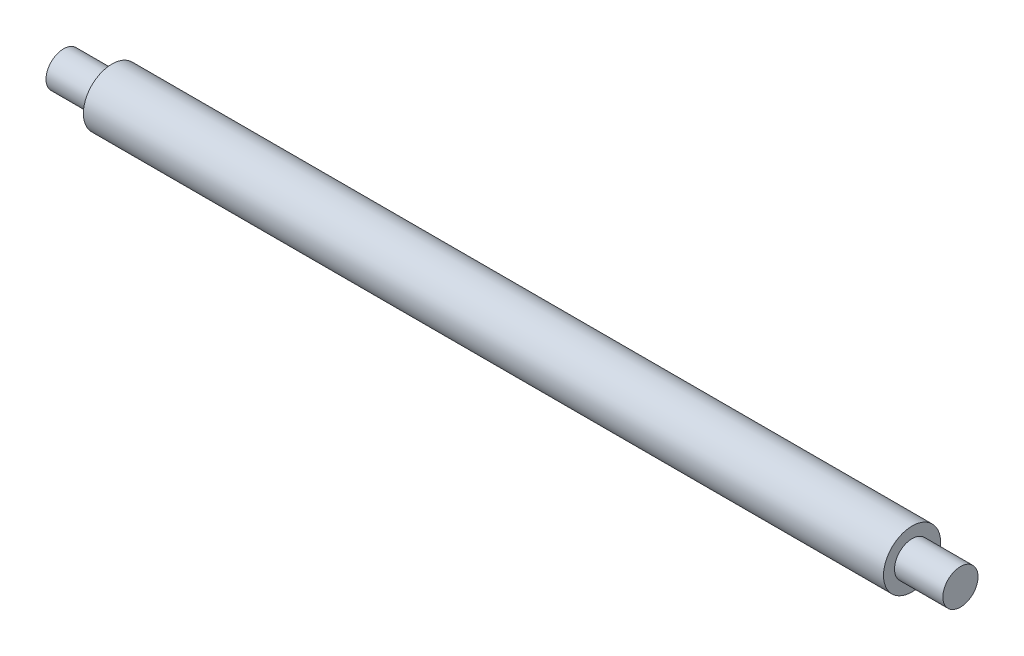
ISO-10303-21;
HEADER;
FILE_DESCRIPTION(('STEP AP214'),'2;1');
FILE_NAME('part.step','',(''),(''),'','','');
FILE_SCHEMA(('AUTOMOTIVE_DESIGN { 1 0 10303 214 1 1 1 1 }'));
ENDSEC;
DATA;
#1=APPLICATION_CONTEXT('core data for automotive mechanical design processes');
#2=APPLICATION_PROTOCOL_DEFINITION('international standard','automotive_design',2000,#1);
#3=PRODUCT_CONTEXT('',#1,'mechanical');
#4=PRODUCT('Part','Part','',(#3));
#5=PRODUCT_RELATED_PRODUCT_CATEGORY('part','',(#4));
#6=PRODUCT_DEFINITION_FORMATION('','',#4);
#7=PRODUCT_DEFINITION_CONTEXT('part definition',#1,'design');
#8=PRODUCT_DEFINITION('design','',#6,#7);
#9=PRODUCT_DEFINITION_SHAPE('','',#8);
#10=(LENGTH_UNIT() NAMED_UNIT(*) SI_UNIT(.MILLI.,.METRE.));
#11=(NAMED_UNIT(*) PLANE_ANGLE_UNIT() SI_UNIT($,.RADIAN.));
#12=(NAMED_UNIT(*) SI_UNIT($,.STERADIAN.) SOLID_ANGLE_UNIT());
#13=UNCERTAINTY_MEASURE_WITH_UNIT(LENGTH_MEASURE(1.E-05),#10,'distance_accuracy_value','');
#14=(GEOMETRIC_REPRESENTATION_CONTEXT(3) GLOBAL_UNCERTAINTY_ASSIGNED_CONTEXT((#13)) GLOBAL_UNIT_ASSIGNED_CONTEXT((#10,
#11,#12)) REPRESENTATION_CONTEXT('',''));
#15=CARTESIAN_POINT('',(0.,0.,0.));
#16=DIRECTION('',(0.,0.,1.));
#17=DIRECTION('',(1.,0.,0.));
#18=AXIS2_PLACEMENT_3D('',#15,#16,#17);
#19=CARTESIAN_POINT('',(0.,4.,0.));
#20=DIRECTION('',(1.,0.,0.));
#21=DIRECTION('',(0.,0.,-1.));
#22=AXIS2_PLACEMENT_3D('',#19,#20,#21);
#23=PLANE('',#22);
#24=CARTESIAN_POINT('',(0.,0.,0.));
#25=DIRECTION('',(-1.,0.,0.));
#26=DIRECTION('',(0.,0.,1.));
#27=AXIS2_PLACEMENT_3D('',#24,#25,#26);
#28=CIRCLE('',#27,4.);
#29=CARTESIAN_POINT('',(0.,0.,4.));
#30=VERTEX_POINT('',#29);
#31=EDGE_CURVE('E64',#30,#30,#28,.T.);
#32=ORIENTED_EDGE('',*,*,#31,.T.);
#33=EDGE_LOOP('',(#32));
#34=FACE_BOUND('',#33,.T.);
#35=ADVANCED_FACE('F37',(#34),#23,.F.);
#36=CARTESIAN_POINT('',(204.,0.,0.));
#37=DIRECTION('',(-1.,0.,0.));
#38=DIRECTION('',(0.,0.,1.));
#39=AXIS2_PLACEMENT_3D('',#36,#37,#38);
#40=PLANE('',#39);
#41=CARTESIAN_POINT('',(204.,0.,0.));
#42=DIRECTION('',(-1.,0.,0.));
#43=DIRECTION('',(0.,0.,1.));
#44=AXIS2_PLACEMENT_3D('',#41,#42,#43);
#45=CIRCLE('',#44,4.);
#46=CARTESIAN_POINT('',(204.,0.,4.));
#47=VERTEX_POINT('',#46);
#48=EDGE_CURVE('E10',#47,#47,#45,.T.);
#49=ORIENTED_EDGE('',*,*,#48,.F.);
#50=EDGE_LOOP('',(#49));
#51=FACE_BOUND('',#50,.T.);
#52=ADVANCED_FACE('F95',(#51),#40,.F.);
#53=CARTESIAN_POINT('',(0.,0.,0.));
#54=DIRECTION('',(-1.,0.,0.));
#55=DIRECTION('',(0.,0.,1.));
#56=AXIS2_PLACEMENT_3D('',#53,#54,#55);
#57=CYLINDRICAL_SURFACE('',#56,4.);
#58=CARTESIAN_POINT('',(193.,0.,0.));
#59=DIRECTION('',(-1.,0.,0.));
#60=DIRECTION('',(0.,0.,1.));
#61=AXIS2_PLACEMENT_3D('',#58,#59,#60);
#62=CIRCLE('',#61,4.);
#63=CARTESIAN_POINT('',(193.,0.,4.));
#64=VERTEX_POINT('',#63);
#65=EDGE_CURVE('E44',#64,#64,#62,.T.);
#66=ORIENTED_EDGE('',*,*,#65,.F.);
#67=EDGE_LOOP('',(#66));
#68=FACE_BOUND('',#67,.T.);
#69=ORIENTED_EDGE('',*,*,#48,.T.);
#70=EDGE_LOOP('',(#69));
#71=FACE_BOUND('',#70,.T.);
#72=ADVANCED_FACE('F90',(#68,#71),#57,.T.);
#73=CARTESIAN_POINT('',(193.,4.,0.));
#74=DIRECTION('',(-1.,0.,0.));
#75=DIRECTION('',(0.,0.,1.));
#76=AXIS2_PLACEMENT_3D('',#73,#74,#75);
#77=PLANE('',#76);
#78=CARTESIAN_POINT('',(193.,0.,0.));
#79=DIRECTION('',(-1.,0.,0.));
#80=DIRECTION('',(0.,0.,1.));
#81=AXIS2_PLACEMENT_3D('',#78,#79,#80);
#82=CIRCLE('',#81,6.5);
#83=CARTESIAN_POINT('',(193.,0.,6.5));
#84=VERTEX_POINT('',#83);
#85=EDGE_CURVE('E49',#84,#84,#82,.T.);
#86=ORIENTED_EDGE('',*,*,#85,.F.);
#87=EDGE_LOOP('',(#86));
#88=FACE_BOUND('',#87,.T.);
#89=ORIENTED_EDGE('',*,*,#65,.T.);
#90=EDGE_LOOP('',(#89));
#91=FACE_BOUND('',#90,.T.);
#92=ADVANCED_FACE('F85',(#88,#91),#77,.F.);
#93=CARTESIAN_POINT('',(0.,0.,0.));
#94=DIRECTION('',(-1.,0.,0.));
#95=DIRECTION('',(0.,0.,1.));
#96=AXIS2_PLACEMENT_3D('',#93,#94,#95);
#97=CYLINDRICAL_SURFACE('',#96,6.49999999999997);
#98=CARTESIAN_POINT('',(11.,0.,0.));
#99=DIRECTION('',(-1.,0.,0.));
#100=DIRECTION('',(0.,0.,1.));
#101=AXIS2_PLACEMENT_3D('',#98,#99,#100);
#102=CIRCLE('',#101,6.49999999999995);
#103=CARTESIAN_POINT('',(11.,0.,6.49999999999995));
#104=VERTEX_POINT('',#103);
#105=EDGE_CURVE('E54',#104,#104,#102,.T.);
#106=ORIENTED_EDGE('',*,*,#105,.F.);
#107=EDGE_LOOP('',(#106));
#108=FACE_BOUND('',#107,.T.);
#109=ORIENTED_EDGE('',*,*,#85,.T.);
#110=EDGE_LOOP('',(#109));
#111=FACE_BOUND('',#110,.T.);
#112=ADVANCED_FACE('F79',(#108,#111),#97,.T.);
#113=CARTESIAN_POINT('',(11.,6.49999999999995,0.));
#114=DIRECTION('',(1.,0.,0.));
#115=DIRECTION('',(0.,0.,-1.));
#116=AXIS2_PLACEMENT_3D('',#113,#114,#115);
#117=PLANE('',#116);
#118=CARTESIAN_POINT('',(11.,0.,0.));
#119=DIRECTION('',(-1.,0.,0.));
#120=DIRECTION('',(0.,0.,1.));
#121=AXIS2_PLACEMENT_3D('',#118,#119,#120);
#122=CIRCLE('',#121,4.);
#123=CARTESIAN_POINT('',(11.,0.,4.));
#124=VERTEX_POINT('',#123);
#125=EDGE_CURVE('E60',#124,#124,#122,.T.);
#126=ORIENTED_EDGE('',*,*,#125,.F.);
#127=EDGE_LOOP('',(#126));
#128=FACE_BOUND('',#127,.T.);
#129=ORIENTED_EDGE('',*,*,#105,.T.);
#130=EDGE_LOOP('',(#129));
#131=FACE_BOUND('',#130,.T.);
#132=ADVANCED_FACE('F73',(#128,#131),#117,.F.);
#133=CARTESIAN_POINT('',(0.,0.,0.));
#134=DIRECTION('',(-1.,0.,0.));
#135=DIRECTION('',(0.,0.,1.));
#136=AXIS2_PLACEMENT_3D('',#133,#134,#135);
#137=CYLINDRICAL_SURFACE('',#136,4.);
#138=ORIENTED_EDGE('',*,*,#31,.F.);
#139=EDGE_LOOP('',(#138));
#140=FACE_BOUND('',#139,.T.);
#141=ORIENTED_EDGE('',*,*,#125,.T.);
#142=EDGE_LOOP('',(#141));
#143=FACE_BOUND('',#142,.T.);
#144=ADVANCED_FACE('F70',(#140,#143),#137,.T.);
#145=CLOSED_SHELL('',(#35,#52,#72,#92,#112,#132,#144));
#146=MANIFOLD_SOLID_BREP('B2',#145);
#147=ADVANCED_BREP_SHAPE_REPRESENTATION('',(#18,#146),#14);
#148=SHAPE_DEFINITION_REPRESENTATION(#9,#147);
ENDSEC;
END-ISO-10303-21;
